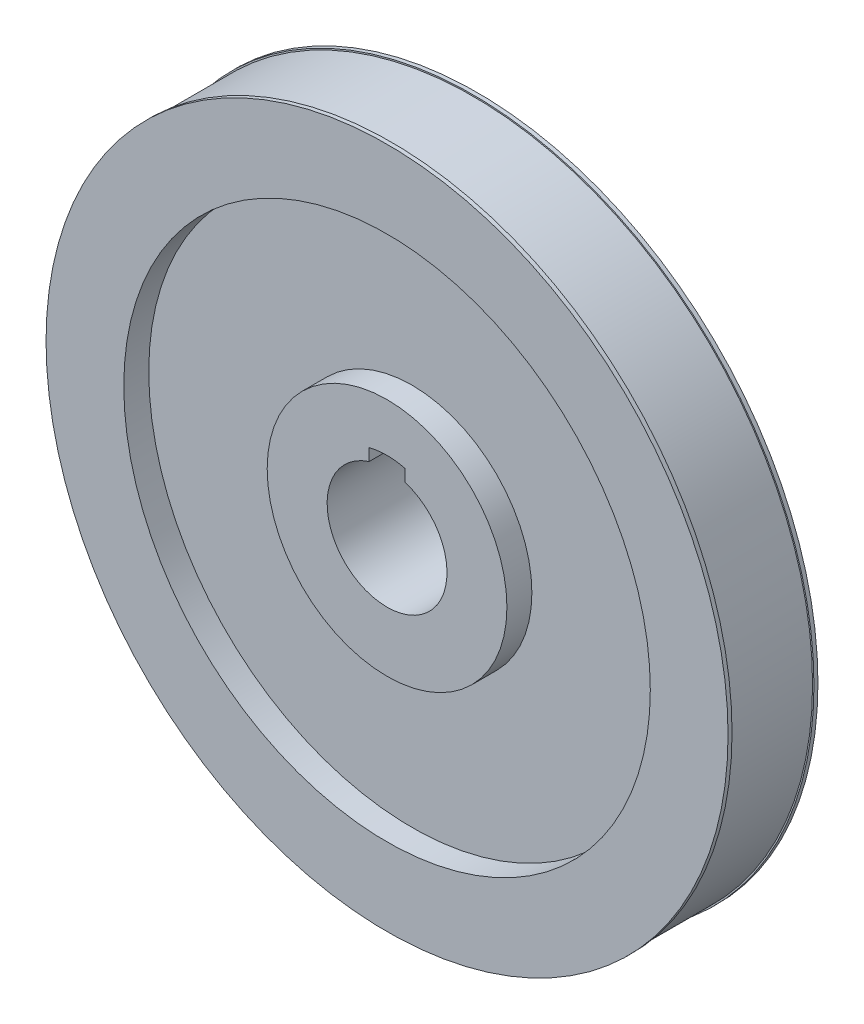
ISO-10303-21;
HEADER;
FILE_DESCRIPTION(('STEP AP214'),'2;1');
FILE_NAME('part.step','',(''),(''),'','','');
FILE_SCHEMA(('AUTOMOTIVE_DESIGN { 1 0 10303 214 1 1 1 1 }'));
ENDSEC;
DATA;
#1=APPLICATION_CONTEXT('core data for automotive mechanical design processes');
#2=APPLICATION_PROTOCOL_DEFINITION('international standard','automotive_design',2000,#1);
#3=PRODUCT_CONTEXT('',#1,'mechanical');
#4=PRODUCT('Part','Part','',(#3));
#5=PRODUCT_RELATED_PRODUCT_CATEGORY('part','',(#4));
#6=PRODUCT_DEFINITION_FORMATION('','',#4);
#7=PRODUCT_DEFINITION_CONTEXT('part definition',#1,'design');
#8=PRODUCT_DEFINITION('design','',#6,#7);
#9=PRODUCT_DEFINITION_SHAPE('','',#8);
#10=(LENGTH_UNIT() NAMED_UNIT(*) SI_UNIT(.MILLI.,.METRE.));
#11=(NAMED_UNIT(*) PLANE_ANGLE_UNIT() SI_UNIT($,.RADIAN.));
#12=(NAMED_UNIT(*) SI_UNIT($,.STERADIAN.) SOLID_ANGLE_UNIT());
#13=UNCERTAINTY_MEASURE_WITH_UNIT(LENGTH_MEASURE(1.E-05),#10,'distance_accuracy_value','');
#14=(GEOMETRIC_REPRESENTATION_CONTEXT(3) GLOBAL_UNCERTAINTY_ASSIGNED_CONTEXT((#13)) GLOBAL_UNIT_ASSIGNED_CONTEXT((#10,
#11,#12)) REPRESENTATION_CONTEXT('',''));
#15=CARTESIAN_POINT('',(0.,0.,0.));
#16=DIRECTION('',(0.,0.,1.));
#17=DIRECTION('',(1.,0.,0.));
#18=AXIS2_PLACEMENT_3D('',#15,#16,#17);
#19=CARTESIAN_POINT('',(0.,0.,22.5));
#20=DIRECTION('',(0.,0.,-1.));
#21=DIRECTION('',(-1.,0.,0.));
#22=AXIS2_PLACEMENT_3D('',#19,#20,#21);
#23=CYLINDRICAL_SURFACE('',#22,170.);
#24=CARTESIAN_POINT('',(0.,0.,20.5));
#25=DIRECTION('',(0.,0.,1.));
#26=DIRECTION('',(1.,0.,0.));
#27=AXIS2_PLACEMENT_3D('',#24,#25,#26);
#28=CIRCLE('',#27,170.);
#29=CARTESIAN_POINT('',(-170.,0.,20.5));
#30=VERTEX_POINT('',#29);
#31=EDGE_CURVE('E140',#30,#30,#28,.T.);
#32=CARTESIAN_POINT('',(0.,0.,-20.5));
#33=DIRECTION('',(0.,0.,-1.));
#34=DIRECTION('',(-1.,0.,0.));
#35=AXIS2_PLACEMENT_3D('',#32,#33,#34);
#36=CIRCLE('',#35,170.);
#37=CARTESIAN_POINT('',(-170.,0.,-20.5));
#38=VERTEX_POINT('',#37);
#39=EDGE_CURVE('E145',#38,#38,#36,.T.);
#40=CARTESIAN_POINT('',(-170.,0.,20.5));
#41=CARTESIAN_POINT('',(-170.,0.,20.0729166666667));
#42=CARTESIAN_POINT('',(-170.,0.,19.6458333333333));
#43=CARTESIAN_POINT('',(-170.,0.,18.7916666666667));
#44=CARTESIAN_POINT('',(-170.,0.,18.3645833333333));
#45=CARTESIAN_POINT('',(-170.,0.,17.5104166666667));
#46=CARTESIAN_POINT('',(-170.,0.,17.0833333333333));
#47=CARTESIAN_POINT('',(-170.,0.,16.2291666666667));
#48=CARTESIAN_POINT('',(-170.,0.,15.8020833333333));
#49=CARTESIAN_POINT('',(-170.,0.,14.9479166666667));
#50=CARTESIAN_POINT('',(-170.,0.,14.5208333333333));
#51=CARTESIAN_POINT('',(-170.,0.,13.6666666666667));
#52=CARTESIAN_POINT('',(-170.,0.,13.2395833333333));
#53=CARTESIAN_POINT('',(-170.,0.,12.3854166666667));
#54=CARTESIAN_POINT('',(-170.,0.,11.9583333333333));
#55=CARTESIAN_POINT('',(-170.,0.,11.1041666666667));
#56=CARTESIAN_POINT('',(-170.,0.,10.6770833333333));
#57=CARTESIAN_POINT('',(-170.,0.,9.82291666666666));
#58=CARTESIAN_POINT('',(-170.,0.,9.39583333333333));
#59=CARTESIAN_POINT('',(-170.,0.,8.54166666666667));
#60=CARTESIAN_POINT('',(-170.,0.,8.11458333333333));
#61=CARTESIAN_POINT('',(-170.,0.,7.26041666666667));
#62=CARTESIAN_POINT('',(-170.,0.,6.83333333333333));
#63=CARTESIAN_POINT('',(-170.,0.,5.97916666666667));
#64=CARTESIAN_POINT('',(-170.,0.,5.55208333333333));
#65=CARTESIAN_POINT('',(-170.,0.,4.69791666666667));
#66=CARTESIAN_POINT('',(-170.,0.,4.27083333333333));
#67=CARTESIAN_POINT('',(-170.,0.,3.41666666666667));
#68=CARTESIAN_POINT('',(-170.,0.,2.98958333333333));
#69=CARTESIAN_POINT('',(-170.,0.,2.13541666666667));
#70=CARTESIAN_POINT('',(-170.,0.,1.70833333333333));
#71=CARTESIAN_POINT('',(-170.,0.,0.854166666666667));
#72=CARTESIAN_POINT('',(-170.,0.,0.427083333333334));
#73=CARTESIAN_POINT('',(-170.,0.,-0.427083333333334));
#74=CARTESIAN_POINT('',(-170.,0.,-0.854166666666667));
#75=CARTESIAN_POINT('',(-170.,0.,-1.70833333333333));
#76=CARTESIAN_POINT('',(-170.,0.,-2.13541666666667));
#77=CARTESIAN_POINT('',(-170.,0.,-2.98958333333333));
#78=CARTESIAN_POINT('',(-170.,0.,-3.41666666666667));
#79=CARTESIAN_POINT('',(-170.,0.,-4.27083333333333));
#80=CARTESIAN_POINT('',(-170.,0.,-4.69791666666667));
#81=CARTESIAN_POINT('',(-170.,0.,-5.55208333333333));
#82=CARTESIAN_POINT('',(-170.,0.,-5.97916666666667));
#83=CARTESIAN_POINT('',(-170.,0.,-6.83333333333333));
#84=CARTESIAN_POINT('',(-170.,0.,-7.26041666666667));
#85=CARTESIAN_POINT('',(-170.,0.,-8.11458333333333));
#86=CARTESIAN_POINT('',(-170.,0.,-8.54166666666666));
#87=CARTESIAN_POINT('',(-170.,0.,-9.39583333333333));
#88=CARTESIAN_POINT('',(-170.,0.,-9.82291666666666));
#89=CARTESIAN_POINT('',(-170.,0.,-10.6770833333333));
#90=CARTESIAN_POINT('',(-170.,0.,-11.1041666666667));
#91=CARTESIAN_POINT('',(-170.,0.,-11.9583333333333));
#92=CARTESIAN_POINT('',(-170.,0.,-12.3854166666667));
#93=CARTESIAN_POINT('',(-170.,0.,-13.2395833333333));
#94=CARTESIAN_POINT('',(-170.,0.,-13.6666666666667));
#95=CARTESIAN_POINT('',(-170.,0.,-14.5208333333333));
#96=CARTESIAN_POINT('',(-170.,0.,-14.9479166666667));
#97=CARTESIAN_POINT('',(-170.,0.,-15.8020833333333));
#98=CARTESIAN_POINT('',(-170.,0.,-16.2291666666667));
#99=CARTESIAN_POINT('',(-170.,0.,-17.0833333333333));
#100=CARTESIAN_POINT('',(-170.,0.,-17.5104166666667));
#101=CARTESIAN_POINT('',(-170.,0.,-18.3645833333333));
#102=CARTESIAN_POINT('',(-170.,0.,-18.7916666666667));
#103=CARTESIAN_POINT('',(-170.,0.,-19.6458333333333));
#104=CARTESIAN_POINT('',(-170.,0.,-20.0729166666667));
#105=CARTESIAN_POINT('',(-170.,0.,-20.5));
#106=B_SPLINE_CURVE_WITH_KNOTS('',3,(#40,#41,#42,#43,#44,#45,#46,#47,#48,#49,#50,#51,#52,#53,
#54,#55,#56,#57,#58,#59,#60,#61,#62,#63,#64,#65,#66,#67,#68,#69,#70,#71,#72,#73,#74,#75,#76,#77,
#78,#79,#80,#81,#82,#83,#84,#85,#86,#87,#88,#89,#90,#91,#92,#93,#94,#95,#96,#97,#98,#99,#100,
#101,#102,#103,#104,#105),.UNSPECIFIED.,.F.,.F.,(4,2,2,2,2,2,2,2,2,2,2,2,2,2,2,2,2,2,2,2,2,2,2,
2,2,2,2,2,2,2,2,2,4),(0.,1.28125,2.5625,3.84375,5.125,6.40625,7.6875,8.96875,10.25,11.53125,
12.8125,14.09375,15.375,16.65625,17.9375,19.21875,20.5,21.78125,23.0625,24.34375,25.625,
26.90625,28.1875,29.46875,30.75,32.03125,33.3125,34.59375,35.875,37.15625,38.4375,39.71875,41.),.UNSPECIFIED.);
#107=EDGE_CURVE('BSEAM35',#30,#38,#106,.T.);
#108=ORIENTED_EDGE('',*,*,#31,.F.);
#109=ORIENTED_EDGE('',*,*,#39,.F.);
#110=ORIENTED_EDGE('',*,*,#107,.T.);
#111=ORIENTED_EDGE('',*,*,#107,.F.);
#112=EDGE_LOOP('',(#108,#110,#109,#111));
#113=FACE_BOUND('',#112,.T.);
#114=ADVANCED_FACE('F35',(#113),#23,.T.);
#115=CARTESIAN_POINT('',(0.,0.,20.5));
#116=DIRECTION('',(0.,0.,1.));
#117=DIRECTION('',(1.,0.,0.));
#118=AXIS2_PLACEMENT_3D('',#115,#116,#117);
#119=CYLINDRICAL_SURFACE('',#118,170.69);
#120=CARTESIAN_POINT('',(0.,0.,20.5));
#121=DIRECTION('',(0.,0.,1.));
#122=DIRECTION('',(1.,0.,0.));
#123=AXIS2_PLACEMENT_3D('',#120,#121,#122);
#124=CIRCLE('',#123,170.69);
#125=CARTESIAN_POINT('',(170.69,0.,20.5));
#126=VERTEX_POINT('',#125);
#127=EDGE_CURVE('E137',#126,#126,#124,.T.);
#128=ORIENTED_EDGE('',*,*,#127,.T.);
#129=EDGE_LOOP('',(#128));
#130=FACE_BOUND('',#129,.T.);
#131=CARTESIAN_POINT('',(0.,0.,22.5));
#132=DIRECTION('',(0.,0.,1.));
#133=DIRECTION('',(1.,0.,0.));
#134=AXIS2_PLACEMENT_3D('',#131,#132,#133);
#135=CIRCLE('',#134,170.69);
#136=CARTESIAN_POINT('',(170.69,0.,22.5));
#137=VERTEX_POINT('',#136);
#138=EDGE_CURVE('E134',#137,#137,#135,.T.);
#139=ORIENTED_EDGE('',*,*,#138,.F.);
#140=EDGE_LOOP('',(#139));
#141=FACE_BOUND('',#140,.T.);
#142=ADVANCED_FACE('F165',(#130,#141),#119,.T.);
#143=CARTESIAN_POINT('',(0.,0.,20.5));
#144=DIRECTION('',(0.,0.,1.));
#145=DIRECTION('',(1.,0.,0.));
#146=AXIS2_PLACEMENT_3D('',#143,#144,#145);
#147=PLANE('',#146);
#148=ORIENTED_EDGE('',*,*,#31,.T.);
#149=EDGE_LOOP('',(#148));
#150=FACE_BOUND('',#149,.T.);
#151=ORIENTED_EDGE('',*,*,#127,.F.);
#152=EDGE_LOOP('',(#151));
#153=FACE_BOUND('',#152,.T.);
#154=ADVANCED_FACE('F170',(#150,#153),#147,.F.);
#155=CARTESIAN_POINT('',(0.,0.,22.5));
#156=DIRECTION('',(0.,0.,1.));
#157=DIRECTION('',(1.,0.,0.));
#158=AXIS2_PLACEMENT_3D('',#155,#156,#157);
#159=PLANE('',#158);
#160=CARTESIAN_POINT('',(0.,0.,22.5));
#161=DIRECTION('',(0.,0.,1.));
#162=DIRECTION('',(1.,0.,0.));
#163=AXIS2_PLACEMENT_3D('',#160,#161,#162);
#164=CIRCLE('',#163,131.78);
#165=CARTESIAN_POINT('',(-131.78,0.,22.5));
#166=VERTEX_POINT('',#165);
#167=EDGE_CURVE('E125',#166,#166,#164,.T.);
#168=ORIENTED_EDGE('',*,*,#167,.F.);
#169=EDGE_LOOP('',(#168));
#170=FACE_BOUND('',#169,.T.);
#171=ORIENTED_EDGE('',*,*,#138,.T.);
#172=EDGE_LOOP('',(#171));
#173=FACE_BOUND('',#172,.T.);
#174=ADVANCED_FACE('F187',(#170,#173),#159,.T.);
#175=CARTESIAN_POINT('',(0.,0.,-20.5));
#176=DIRECTION('',(0.,0.,-1.));
#177=DIRECTION('',(-1.,0.,0.));
#178=AXIS2_PLACEMENT_3D('',#175,#176,#177);
#179=CYLINDRICAL_SURFACE('',#178,170.69);
#180=CARTESIAN_POINT('',(0.,0.,-20.5));
#181=DIRECTION('',(0.,0.,1.));
#182=DIRECTION('',(1.,0.,0.));
#183=AXIS2_PLACEMENT_3D('',#180,#181,#182);
#184=CIRCLE('',#183,170.69);
#185=CARTESIAN_POINT('',(170.69,0.,-20.5));
#186=VERTEX_POINT('',#185);
#187=EDGE_CURVE('E131',#186,#186,#184,.T.);
#188=ORIENTED_EDGE('',*,*,#187,.F.);
#189=EDGE_LOOP('',(#188));
#190=FACE_BOUND('',#189,.T.);
#191=CARTESIAN_POINT('',(0.,0.,-22.5));
#192=DIRECTION('',(0.,0.,1.));
#193=DIRECTION('',(1.,0.,0.));
#194=AXIS2_PLACEMENT_3D('',#191,#192,#193);
#195=CIRCLE('',#194,170.69);
#196=CARTESIAN_POINT('',(170.69,0.,-22.5));
#197=VERTEX_POINT('',#196);
#198=EDGE_CURVE('E128',#197,#197,#195,.T.);
#199=ORIENTED_EDGE('',*,*,#198,.T.);
#200=EDGE_LOOP('',(#199));
#201=FACE_BOUND('',#200,.T.);
#202=ADVANCED_FACE('F181',(#190,#201),#179,.T.);
#203=CARTESIAN_POINT('',(0.,0.,-20.5));
#204=DIRECTION('',(0.,0.,-1.));
#205=DIRECTION('',(1.,0.,0.));
#206=AXIS2_PLACEMENT_3D('',#203,#204,#205);
#207=PLANE('',#206);
#208=ORIENTED_EDGE('',*,*,#39,.T.);
#209=EDGE_LOOP('',(#208));
#210=FACE_BOUND('',#209,.T.);
#211=ORIENTED_EDGE('',*,*,#187,.T.);
#212=EDGE_LOOP('',(#211));
#213=FACE_BOUND('',#212,.T.);
#214=ADVANCED_FACE('F177',(#210,#213),#207,.F.);
#215=CARTESIAN_POINT('',(0.,0.,-22.5));
#216=DIRECTION('',(0.,0.,1.));
#217=DIRECTION('',(1.,0.,0.));
#218=AXIS2_PLACEMENT_3D('',#215,#216,#217);
#219=PLANE('',#218);
#220=CARTESIAN_POINT('',(0.,0.,-22.5));
#221=DIRECTION('',(0.,0.,1.));
#222=DIRECTION('',(1.,0.,0.));
#223=AXIS2_PLACEMENT_3D('',#220,#221,#222);
#224=CIRCLE('',#223,131.78);
#225=CARTESIAN_POINT('',(131.78,0.,-22.5));
#226=VERTEX_POINT('',#225);
#227=EDGE_CURVE('E113',#226,#226,#224,.T.);
#228=ORIENTED_EDGE('',*,*,#227,.T.);
#229=EDGE_LOOP('',(#228));
#230=FACE_BOUND('',#229,.T.);
#231=ORIENTED_EDGE('',*,*,#198,.F.);
#232=EDGE_LOOP('',(#231));
#233=FACE_BOUND('',#232,.T.);
#234=ADVANCED_FACE('F180',(#230,#233),#219,.F.);
#235=CARTESIAN_POINT('',(0.,0.,10.));
#236=DIRECTION('',(0.,0.,1.));
#237=DIRECTION('',(1.,0.,0.));
#238=AXIS2_PLACEMENT_3D('',#235,#236,#237);
#239=PLANE('',#238);
#240=CARTESIAN_POINT('',(0.,0.,10.));
#241=DIRECTION('',(0.,0.,1.));
#242=DIRECTION('',(1.,0.,0.));
#243=AXIS2_PLACEMENT_3D('',#240,#241,#242);
#244=CIRCLE('',#243,131.78);
#245=CARTESIAN_POINT('',(-131.78,0.,10.));
#246=VERTEX_POINT('',#245);
#247=EDGE_CURVE('E122',#246,#246,#244,.T.);
#248=ORIENTED_EDGE('',*,*,#247,.T.);
#249=EDGE_LOOP('',(#248));
#250=FACE_BOUND('',#249,.T.);
#251=CARTESIAN_POINT('',(0.,0.,10.));
#252=DIRECTION('',(0.,0.,1.));
#253=DIRECTION('',(1.,0.,0.));
#254=AXIS2_PLACEMENT_3D('',#251,#252,#253);
#255=CIRCLE('',#254,60.);
#256=CARTESIAN_POINT('',(-60.,0.,10.));
#257=VERTEX_POINT('',#256);
#258=EDGE_CURVE('E116',#257,#257,#255,.T.);
#259=ORIENTED_EDGE('',*,*,#258,.F.);
#260=EDGE_LOOP('',(#259));
#261=FACE_BOUND('',#260,.T.);
#262=ADVANCED_FACE('F192',(#250,#261),#239,.T.);
#263=CARTESIAN_POINT('',(0.,0.,22.5));
#264=DIRECTION('',(0.,0.,-1.));
#265=DIRECTION('',(-1.,0.,0.));
#266=AXIS2_PLACEMENT_3D('',#263,#264,#265);
#267=CYLINDRICAL_SURFACE('',#266,131.78);
#268=CARTESIAN_POINT('',(-131.78,0.,22.5));
#269=CARTESIAN_POINT('',(-131.78,0.,22.3697916666667));
#270=CARTESIAN_POINT('',(-131.78,0.,22.2395833333333));
#271=CARTESIAN_POINT('',(-131.78,0.,21.9791666666667));
#272=CARTESIAN_POINT('',(-131.78,0.,21.8489583333333));
#273=CARTESIAN_POINT('',(-131.78,0.,21.5885416666667));
#274=CARTESIAN_POINT('',(-131.78,0.,21.4583333333333));
#275=CARTESIAN_POINT('',(-131.78,0.,21.1979166666667));
#276=CARTESIAN_POINT('',(-131.78,0.,21.0677083333333));
#277=CARTESIAN_POINT('',(-131.78,0.,20.8072916666667));
#278=CARTESIAN_POINT('',(-131.78,0.,20.6770833333333));
#279=CARTESIAN_POINT('',(-131.78,0.,20.4166666666667));
#280=CARTESIAN_POINT('',(-131.78,0.,20.2864583333333));
#281=CARTESIAN_POINT('',(-131.78,0.,20.0260416666667));
#282=CARTESIAN_POINT('',(-131.78,0.,19.8958333333333));
#283=CARTESIAN_POINT('',(-131.78,0.,19.6354166666667));
#284=CARTESIAN_POINT('',(-131.78,0.,19.5052083333333));
#285=CARTESIAN_POINT('',(-131.78,0.,19.2447916666667));
#286=CARTESIAN_POINT('',(-131.78,0.,19.1145833333333));
#287=CARTESIAN_POINT('',(-131.78,0.,18.8541666666667));
#288=CARTESIAN_POINT('',(-131.78,0.,18.7239583333333));
#289=CARTESIAN_POINT('',(-131.78,0.,18.4635416666667));
#290=CARTESIAN_POINT('',(-131.78,0.,18.3333333333333));
#291=CARTESIAN_POINT('',(-131.78,0.,18.0729166666667));
#292=CARTESIAN_POINT('',(-131.78,0.,17.9427083333333));
#293=CARTESIAN_POINT('',(-131.78,0.,17.6822916666667));
#294=CARTESIAN_POINT('',(-131.78,0.,17.5520833333333));
#295=CARTESIAN_POINT('',(-131.78,0.,17.2916666666667));
#296=CARTESIAN_POINT('',(-131.78,0.,17.1614583333333));
#297=CARTESIAN_POINT('',(-131.78,0.,16.9010416666667));
#298=CARTESIAN_POINT('',(-131.78,0.,16.7708333333333));
#299=CARTESIAN_POINT('',(-131.78,0.,16.5104166666667));
#300=CARTESIAN_POINT('',(-131.78,0.,16.3802083333333));
#301=CARTESIAN_POINT('',(-131.78,0.,16.1197916666667));
#302=CARTESIAN_POINT('',(-131.78,0.,15.9895833333333));
#303=CARTESIAN_POINT('',(-131.78,0.,15.7291666666667));
#304=CARTESIAN_POINT('',(-131.78,0.,15.5989583333333));
#305=CARTESIAN_POINT('',(-131.78,0.,15.3385416666667));
#306=CARTESIAN_POINT('',(-131.78,0.,15.2083333333333));
#307=CARTESIAN_POINT('',(-131.78,0.,14.9479166666667));
#308=CARTESIAN_POINT('',(-131.78,0.,14.8177083333333));
#309=CARTESIAN_POINT('',(-131.78,0.,14.5572916666667));
#310=CARTESIAN_POINT('',(-131.78,0.,14.4270833333333));
#311=CARTESIAN_POINT('',(-131.78,0.,14.1666666666667));
#312=CARTESIAN_POINT('',(-131.78,0.,14.0364583333333));
#313=CARTESIAN_POINT('',(-131.78,0.,13.7760416666667));
#314=CARTESIAN_POINT('',(-131.78,0.,13.6458333333333));
#315=CARTESIAN_POINT('',(-131.78,0.,13.3854166666667));
#316=CARTESIAN_POINT('',(-131.78,0.,13.2552083333333));
#317=CARTESIAN_POINT('',(-131.78,0.,12.9947916666667));
#318=CARTESIAN_POINT('',(-131.78,0.,12.8645833333333));
#319=CARTESIAN_POINT('',(-131.78,0.,12.6041666666667));
#320=CARTESIAN_POINT('',(-131.78,0.,12.4739583333333));
#321=CARTESIAN_POINT('',(-131.78,0.,12.2135416666667));
#322=CARTESIAN_POINT('',(-131.78,0.,12.0833333333333));
#323=CARTESIAN_POINT('',(-131.78,0.,11.8229166666667));
#324=CARTESIAN_POINT('',(-131.78,0.,11.6927083333333));
#325=CARTESIAN_POINT('',(-131.78,0.,11.4322916666667));
#326=CARTESIAN_POINT('',(-131.78,0.,11.3020833333333));
#327=CARTESIAN_POINT('',(-131.78,0.,11.0416666666667));
#328=CARTESIAN_POINT('',(-131.78,0.,10.9114583333333));
#329=CARTESIAN_POINT('',(-131.78,0.,10.6510416666667));
#330=CARTESIAN_POINT('',(-131.78,0.,10.5208333333333));
#331=CARTESIAN_POINT('',(-131.78,0.,10.2604166666667));
#332=CARTESIAN_POINT('',(-131.78,0.,10.1302083333333));
#333=CARTESIAN_POINT('',(-131.78,0.,10.));
#334=B_SPLINE_CURVE_WITH_KNOTS('',3,(#268,#269,#270,#271,#272,#273,#274,#275,#276,#277,#278,
#279,#280,#281,#282,#283,#284,#285,#286,#287,#288,#289,#290,#291,#292,#293,#294,#295,#296,#297,
#298,#299,#300,#301,#302,#303,#304,#305,#306,#307,#308,#309,#310,#311,#312,#313,#314,#315,#316,
#317,#318,#319,#320,#321,#322,#323,#324,#325,#326,#327,#328,#329,#330,#331,#332,#333),
.UNSPECIFIED.,.F.,.F.,(4,2,2,2,2,2,2,2,2,2,2,2,2,2,2,2,2,2,2,2,2,2,2,2,2,2,2,2,2,2,2,2,4),(0.,
0.390625000000002,0.781250000000001,1.171875,1.5625,1.953125,2.34375,2.734375,3.125,3.515625,
3.90625,4.296875,4.6875,5.078125,5.46875,5.859375,6.25,6.640625,7.03125,7.421875,7.8125,
8.203125,8.59375,8.984375,9.375,9.765625,10.15625,10.546875,10.9375,11.328125,11.71875,
12.109375,12.5),.UNSPECIFIED.);
#335=EDGE_CURVE('BSEAM197',#166,#246,#334,.T.);
#336=ORIENTED_EDGE('',*,*,#167,.T.);
#337=ORIENTED_EDGE('',*,*,#247,.F.);
#338=ORIENTED_EDGE('',*,*,#335,.T.);
#339=ORIENTED_EDGE('',*,*,#335,.F.);
#340=EDGE_LOOP('',(#336,#338,#337,#339));
#341=FACE_BOUND('',#340,.T.);
#342=ADVANCED_FACE('F197',(#341),#267,.F.);
#343=CARTESIAN_POINT('',(0.,0.,22.5));
#344=DIRECTION('',(0.,0.,-1.));
#345=DIRECTION('',(-1.,0.,0.));
#346=AXIS2_PLACEMENT_3D('',#343,#344,#345);
#347=CYLINDRICAL_SURFACE('',#346,60.);
#348=CARTESIAN_POINT('',(0.,0.,22.5));
#349=DIRECTION('',(0.,0.,1.));
#350=DIRECTION('',(1.,0.,0.));
#351=AXIS2_PLACEMENT_3D('',#348,#349,#350);
#352=CIRCLE('',#351,60.);
#353=CARTESIAN_POINT('',(-60.,0.,22.5));
#354=VERTEX_POINT('',#353);
#355=EDGE_CURVE('E119',#354,#354,#352,.T.);
#356=CARTESIAN_POINT('',(-60.,0.,22.5));
#357=CARTESIAN_POINT('',(-60.,0.,22.3697916666667));
#358=CARTESIAN_POINT('',(-60.,0.,22.2395833333333));
#359=CARTESIAN_POINT('',(-60.,0.,21.9791666666667));
#360=CARTESIAN_POINT('',(-60.,0.,21.8489583333333));
#361=CARTESIAN_POINT('',(-60.,0.,21.5885416666667));
#362=CARTESIAN_POINT('',(-60.,0.,21.4583333333333));
#363=CARTESIAN_POINT('',(-60.,0.,21.1979166666667));
#364=CARTESIAN_POINT('',(-60.,0.,21.0677083333333));
#365=CARTESIAN_POINT('',(-60.,0.,20.8072916666667));
#366=CARTESIAN_POINT('',(-60.,0.,20.6770833333333));
#367=CARTESIAN_POINT('',(-60.,0.,20.4166666666667));
#368=CARTESIAN_POINT('',(-60.,0.,20.2864583333333));
#369=CARTESIAN_POINT('',(-60.,0.,20.0260416666667));
#370=CARTESIAN_POINT('',(-60.,0.,19.8958333333333));
#371=CARTESIAN_POINT('',(-60.,0.,19.6354166666667));
#372=CARTESIAN_POINT('',(-60.,0.,19.5052083333333));
#373=CARTESIAN_POINT('',(-60.,0.,19.2447916666667));
#374=CARTESIAN_POINT('',(-60.,0.,19.1145833333333));
#375=CARTESIAN_POINT('',(-60.,0.,18.8541666666667));
#376=CARTESIAN_POINT('',(-60.,0.,18.7239583333333));
#377=CARTESIAN_POINT('',(-60.,0.,18.4635416666667));
#378=CARTESIAN_POINT('',(-60.,0.,18.3333333333333));
#379=CARTESIAN_POINT('',(-60.,0.,18.0729166666667));
#380=CARTESIAN_POINT('',(-60.,0.,17.9427083333333));
#381=CARTESIAN_POINT('',(-60.,0.,17.6822916666667));
#382=CARTESIAN_POINT('',(-60.,0.,17.5520833333333));
#383=CARTESIAN_POINT('',(-60.,0.,17.2916666666667));
#384=CARTESIAN_POINT('',(-60.,0.,17.1614583333333));
#385=CARTESIAN_POINT('',(-60.,0.,16.9010416666667));
#386=CARTESIAN_POINT('',(-60.,0.,16.7708333333333));
#387=CARTESIAN_POINT('',(-60.,0.,16.5104166666667));
#388=CARTESIAN_POINT('',(-60.,0.,16.3802083333333));
#389=CARTESIAN_POINT('',(-60.,0.,16.1197916666667));
#390=CARTESIAN_POINT('',(-60.,0.,15.9895833333333));
#391=CARTESIAN_POINT('',(-60.,0.,15.7291666666667));
#392=CARTESIAN_POINT('',(-60.,0.,15.5989583333333));
#393=CARTESIAN_POINT('',(-60.,0.,15.3385416666667));
#394=CARTESIAN_POINT('',(-60.,0.,15.2083333333333));
#395=CARTESIAN_POINT('',(-60.,0.,14.9479166666667));
#396=CARTESIAN_POINT('',(-60.,0.,14.8177083333333));
#397=CARTESIAN_POINT('',(-60.,0.,14.5572916666667));
#398=CARTESIAN_POINT('',(-60.,0.,14.4270833333333));
#399=CARTESIAN_POINT('',(-60.,0.,14.1666666666667));
#400=CARTESIAN_POINT('',(-60.,0.,14.0364583333333));
#401=CARTESIAN_POINT('',(-60.,0.,13.7760416666667));
#402=CARTESIAN_POINT('',(-60.,0.,13.6458333333333));
#403=CARTESIAN_POINT('',(-60.,0.,13.3854166666667));
#404=CARTESIAN_POINT('',(-60.,0.,13.2552083333333));
#405=CARTESIAN_POINT('',(-60.,0.,12.9947916666667));
#406=CARTESIAN_POINT('',(-60.,0.,12.8645833333333));
#407=CARTESIAN_POINT('',(-60.,0.,12.6041666666667));
#408=CARTESIAN_POINT('',(-60.,0.,12.4739583333333));
#409=CARTESIAN_POINT('',(-60.,0.,12.2135416666667));
#410=CARTESIAN_POINT('',(-60.,0.,12.0833333333333));
#411=CARTESIAN_POINT('',(-60.,0.,11.8229166666667));
#412=CARTESIAN_POINT('',(-60.,0.,11.6927083333333));
#413=CARTESIAN_POINT('',(-60.,0.,11.4322916666667));
#414=CARTESIAN_POINT('',(-60.,0.,11.3020833333333));
#415=CARTESIAN_POINT('',(-60.,0.,11.0416666666667));
#416=CARTESIAN_POINT('',(-60.,0.,10.9114583333333));
#417=CARTESIAN_POINT('',(-60.,0.,10.6510416666667));
#418=CARTESIAN_POINT('',(-60.,0.,10.5208333333333));
#419=CARTESIAN_POINT('',(-60.,0.,10.2604166666667));
#420=CARTESIAN_POINT('',(-60.,0.,10.1302083333333));
#421=CARTESIAN_POINT('',(-60.,0.,10.));
#422=B_SPLINE_CURVE_WITH_KNOTS('',3,(#356,#357,#358,#359,#360,#361,#362,#363,#364,#365,#366,
#367,#368,#369,#370,#371,#372,#373,#374,#375,#376,#377,#378,#379,#380,#381,#382,#383,#384,#385,
#386,#387,#388,#389,#390,#391,#392,#393,#394,#395,#396,#397,#398,#399,#400,#401,#402,#403,#404,
#405,#406,#407,#408,#409,#410,#411,#412,#413,#414,#415,#416,#417,#418,#419,#420,#421),
.UNSPECIFIED.,.F.,.F.,(4,2,2,2,2,2,2,2,2,2,2,2,2,2,2,2,2,2,2,2,2,2,2,2,2,2,2,2,2,2,2,2,4),(0.,
0.390625000000002,0.781250000000001,1.171875,1.5625,1.953125,2.34375,2.734375,3.125,3.515625,
3.90625,4.296875,4.6875,5.078125,5.46875,5.859375,6.25,6.640625,7.03125,7.421875,7.8125,
8.203125,8.59375,8.984375,9.375,9.765625,10.15625,10.546875,10.9375,11.328125,11.71875,
12.109375,12.5),.UNSPECIFIED.);
#423=EDGE_CURVE('BSEAM220',#354,#257,#422,.T.);
#424=ORIENTED_EDGE('',*,*,#355,.F.);
#425=ORIENTED_EDGE('',*,*,#258,.T.);
#426=ORIENTED_EDGE('',*,*,#423,.T.);
#427=ORIENTED_EDGE('',*,*,#423,.F.);
#428=EDGE_LOOP('',(#424,#426,#425,#427));
#429=FACE_BOUND('',#428,.T.);
#430=ADVANCED_FACE('F220',(#429),#347,.T.);
#431=DIRECTION('',(0.,-1.,0.));
#432=VECTOR('',#431,1.);
#433=CARTESIAN_POINT('',(-9.,20.2728873002203,22.5));
#434=LINE('',#433,#432);
#435=CARTESIAN_POINT('',(-9.,34.6502525243323,22.5));
#436=VERTEX_POINT('',#435);
#437=CARTESIAN_POINT('',(-9.,28.6181760425084,22.5));
#438=VERTEX_POINT('',#437);
#439=EDGE_CURVE('E93',#436,#438,#434,.T.);
#440=ORIENTED_EDGE('',*,*,#439,.F.);
#441=CARTESIAN_POINT('',(0.,0.,22.5));
#442=DIRECTION('',(0.,0.,1.));
#443=DIRECTION('',(1.,0.,0.));
#444=AXIS2_PLACEMENT_3D('',#441,#442,#443);
#445=CIRCLE('',#444,35.8);
#446=CARTESIAN_POINT('',(8.99999999999999,34.6502525243323,22.5));
#447=VERTEX_POINT('',#446);
#448=EDGE_CURVE('E95',#447,#436,#445,.T.);
#449=ORIENTED_EDGE('',*,*,#448,.F.);
#450=DIRECTION('',(0.,1.,0.));
#451=VECTOR('',#450,1.);
#452=CARTESIAN_POINT('',(9.,20.2728873002203,22.5));
#453=LINE('',#452,#451);
#454=CARTESIAN_POINT('',(9.,28.6181760425084,22.5));
#455=VERTEX_POINT('',#454);
#456=EDGE_CURVE('E76',#455,#447,#453,.T.);
#457=ORIENTED_EDGE('',*,*,#456,.F.);
#458=CARTESIAN_POINT('',(0.,0.,22.5));
#459=DIRECTION('',(0.,0.,1.));
#460=DIRECTION('',(1.,0.,0.));
#461=AXIS2_PLACEMENT_3D('',#458,#459,#460);
#462=CIRCLE('',#461,30.);
#463=EDGE_CURVE('E101',#438,#455,#462,.T.);
#464=ORIENTED_EDGE('',*,*,#463,.F.);
#465=EDGE_LOOP('',(#440,#449,#457,#464));
#466=FACE_BOUND('',#465,.T.);
#467=ORIENTED_EDGE('',*,*,#355,.T.);
#468=EDGE_LOOP('',(#467));
#469=FACE_BOUND('',#468,.T.);
#470=ADVANCED_FACE('F152',(#466,#469),#159,.T.);
#471=CARTESIAN_POINT('',(0.,0.,-22.5));
#472=DIRECTION('',(0.,0.,1.));
#473=DIRECTION('',(1.,0.,0.));
#474=AXIS2_PLACEMENT_3D('',#471,#472,#473);
#475=CYLINDRICAL_SURFACE('',#474,131.78);
#476=CARTESIAN_POINT('',(0.,0.,-10.));
#477=DIRECTION('',(0.,0.,1.));
#478=DIRECTION('',(1.,0.,0.));
#479=AXIS2_PLACEMENT_3D('',#476,#477,#478);
#480=CIRCLE('',#479,131.78);
#481=CARTESIAN_POINT('',(131.78,0.,-10.));
#482=VERTEX_POINT('',#481);
#483=EDGE_CURVE('E110',#482,#482,#480,.T.);
#484=CARTESIAN_POINT('',(131.78,0.,-22.5));
#485=CARTESIAN_POINT('',(131.78,0.,-22.3697916666667));
#486=CARTESIAN_POINT('',(131.78,0.,-22.2395833333333));
#487=CARTESIAN_POINT('',(131.78,0.,-21.9791666666667));
#488=CARTESIAN_POINT('',(131.78,0.,-21.8489583333333));
#489=CARTESIAN_POINT('',(131.78,0.,-21.5885416666667));
#490=CARTESIAN_POINT('',(131.78,0.,-21.4583333333333));
#491=CARTESIAN_POINT('',(131.78,0.,-21.1979166666667));
#492=CARTESIAN_POINT('',(131.78,0.,-21.0677083333333));
#493=CARTESIAN_POINT('',(131.78,0.,-20.8072916666667));
#494=CARTESIAN_POINT('',(131.78,0.,-20.6770833333333));
#495=CARTESIAN_POINT('',(131.78,0.,-20.4166666666667));
#496=CARTESIAN_POINT('',(131.78,0.,-20.2864583333333));
#497=CARTESIAN_POINT('',(131.78,0.,-20.0260416666667));
#498=CARTESIAN_POINT('',(131.78,0.,-19.8958333333333));
#499=CARTESIAN_POINT('',(131.78,0.,-19.6354166666667));
#500=CARTESIAN_POINT('',(131.78,0.,-19.5052083333333));
#501=CARTESIAN_POINT('',(131.78,0.,-19.2447916666667));
#502=CARTESIAN_POINT('',(131.78,0.,-19.1145833333333));
#503=CARTESIAN_POINT('',(131.78,0.,-18.8541666666667));
#504=CARTESIAN_POINT('',(131.78,0.,-18.7239583333333));
#505=CARTESIAN_POINT('',(131.78,0.,-18.4635416666667));
#506=CARTESIAN_POINT('',(131.78,0.,-18.3333333333333));
#507=CARTESIAN_POINT('',(131.78,0.,-18.0729166666667));
#508=CARTESIAN_POINT('',(131.78,0.,-17.9427083333333));
#509=CARTESIAN_POINT('',(131.78,0.,-17.6822916666667));
#510=CARTESIAN_POINT('',(131.78,0.,-17.5520833333333));
#511=CARTESIAN_POINT('',(131.78,0.,-17.2916666666667));
#512=CARTESIAN_POINT('',(131.78,0.,-17.1614583333333));
#513=CARTESIAN_POINT('',(131.78,0.,-16.9010416666667));
#514=CARTESIAN_POINT('',(131.78,0.,-16.7708333333333));
#515=CARTESIAN_POINT('',(131.78,0.,-16.5104166666667));
#516=CARTESIAN_POINT('',(131.78,0.,-16.3802083333333));
#517=CARTESIAN_POINT('',(131.78,0.,-16.1197916666667));
#518=CARTESIAN_POINT('',(131.78,0.,-15.9895833333333));
#519=CARTESIAN_POINT('',(131.78,0.,-15.7291666666667));
#520=CARTESIAN_POINT('',(131.78,0.,-15.5989583333333));
#521=CARTESIAN_POINT('',(131.78,0.,-15.3385416666667));
#522=CARTESIAN_POINT('',(131.78,0.,-15.2083333333333));
#523=CARTESIAN_POINT('',(131.78,0.,-14.9479166666667));
#524=CARTESIAN_POINT('',(131.78,0.,-14.8177083333333));
#525=CARTESIAN_POINT('',(131.78,0.,-14.5572916666667));
#526=CARTESIAN_POINT('',(131.78,0.,-14.4270833333333));
#527=CARTESIAN_POINT('',(131.78,0.,-14.1666666666667));
#528=CARTESIAN_POINT('',(131.78,0.,-14.0364583333333));
#529=CARTESIAN_POINT('',(131.78,0.,-13.7760416666667));
#530=CARTESIAN_POINT('',(131.78,0.,-13.6458333333333));
#531=CARTESIAN_POINT('',(131.78,0.,-13.3854166666667));
#532=CARTESIAN_POINT('',(131.78,0.,-13.2552083333333));
#533=CARTESIAN_POINT('',(131.78,0.,-12.9947916666667));
#534=CARTESIAN_POINT('',(131.78,0.,-12.8645833333333));
#535=CARTESIAN_POINT('',(131.78,0.,-12.6041666666667));
#536=CARTESIAN_POINT('',(131.78,0.,-12.4739583333333));
#537=CARTESIAN_POINT('',(131.78,0.,-12.2135416666667));
#538=CARTESIAN_POINT('',(131.78,0.,-12.0833333333333));
#539=CARTESIAN_POINT('',(131.78,0.,-11.8229166666667));
#540=CARTESIAN_POINT('',(131.78,0.,-11.6927083333333));
#541=CARTESIAN_POINT('',(131.78,0.,-11.4322916666667));
#542=CARTESIAN_POINT('',(131.78,0.,-11.3020833333333));
#543=CARTESIAN_POINT('',(131.78,0.,-11.0416666666667));
#544=CARTESIAN_POINT('',(131.78,0.,-10.9114583333333));
#545=CARTESIAN_POINT('',(131.78,0.,-10.6510416666667));
#546=CARTESIAN_POINT('',(131.78,0.,-10.5208333333333));
#547=CARTESIAN_POINT('',(131.78,0.,-10.2604166666667));
#548=CARTESIAN_POINT('',(131.78,0.,-10.1302083333333));
#549=CARTESIAN_POINT('',(131.78,0.,-10.));
#550=B_SPLINE_CURVE_WITH_KNOTS('',3,(#484,#485,#486,#487,#488,#489,#490,#491,#492,#493,#494,
#495,#496,#497,#498,#499,#500,#501,#502,#503,#504,#505,#506,#507,#508,#509,#510,#511,#512,#513,
#514,#515,#516,#517,#518,#519,#520,#521,#522,#523,#524,#525,#526,#527,#528,#529,#530,#531,#532,
#533,#534,#535,#536,#537,#538,#539,#540,#541,#542,#543,#544,#545,#546,#547,#548,#549),
.UNSPECIFIED.,.F.,.F.,(4,2,2,2,2,2,2,2,2,2,2,2,2,2,2,2,2,2,2,2,2,2,2,2,2,2,2,2,2,2,2,2,4),(0.,
0.390624999999999,0.781249999999997,1.171875,1.5625,1.953125,2.34375,2.734375,3.125,3.515625,
3.90625,4.296875,4.6875,5.078125,5.46875,5.859375,6.25,6.640625,7.03125,7.421875,7.8125,
8.203125,8.59375,8.984375,9.375,9.765625,10.15625,10.546875,10.9375,11.328125,11.71875,
12.109375,12.5),.UNSPECIFIED.);
#551=EDGE_CURVE('BSEAM212',#226,#482,#550,.T.);
#552=ORIENTED_EDGE('',*,*,#227,.F.);
#553=ORIENTED_EDGE('',*,*,#483,.T.);
#554=ORIENTED_EDGE('',*,*,#551,.T.);
#555=ORIENTED_EDGE('',*,*,#551,.F.);
#556=EDGE_LOOP('',(#552,#554,#553,#555));
#557=FACE_BOUND('',#556,.T.);
#558=ADVANCED_FACE('F212',(#557),#475,.F.);
#559=CARTESIAN_POINT('',(0.,0.,-10.));
#560=DIRECTION('',(0.,0.,-1.));
#561=DIRECTION('',(1.,0.,0.));
#562=AXIS2_PLACEMENT_3D('',#559,#560,#561);
#563=PLANE('',#562);
#564=CARTESIAN_POINT('',(0.,0.,-10.));
#565=DIRECTION('',(0.,0.,1.));
#566=DIRECTION('',(1.,0.,0.));
#567=AXIS2_PLACEMENT_3D('',#564,#565,#566);
#568=CIRCLE('',#567,60.);
#569=CARTESIAN_POINT('',(60.,0.,-10.));
#570=VERTEX_POINT('',#569);
#571=EDGE_CURVE('E104',#570,#570,#568,.T.);
#572=ORIENTED_EDGE('',*,*,#571,.T.);
#573=EDGE_LOOP('',(#572));
#574=FACE_BOUND('',#573,.T.);
#575=ORIENTED_EDGE('',*,*,#483,.F.);
#576=EDGE_LOOP('',(#575));
#577=FACE_BOUND('',#576,.T.);
#578=ADVANCED_FACE('F206',(#574,#577),#563,.T.);
#579=CARTESIAN_POINT('',(0.,0.,-22.5));
#580=DIRECTION('',(0.,0.,1.));
#581=DIRECTION('',(1.,0.,0.));
#582=AXIS2_PLACEMENT_3D('',#579,#580,#581);
#583=CYLINDRICAL_SURFACE('',#582,60.);
#584=CARTESIAN_POINT('',(0.,0.,-22.5));
#585=DIRECTION('',(0.,0.,1.));
#586=DIRECTION('',(1.,0.,0.));
#587=AXIS2_PLACEMENT_3D('',#584,#585,#586);
#588=CIRCLE('',#587,60.);
#589=CARTESIAN_POINT('',(60.,0.,-22.5));
#590=VERTEX_POINT('',#589);
#591=EDGE_CURVE('E107',#590,#590,#588,.T.);
#592=CARTESIAN_POINT('',(60.,0.,-22.5));
#593=CARTESIAN_POINT('',(60.,0.,-22.3697916666667));
#594=CARTESIAN_POINT('',(60.,0.,-22.2395833333333));
#595=CARTESIAN_POINT('',(60.,0.,-21.9791666666667));
#596=CARTESIAN_POINT('',(60.,0.,-21.8489583333333));
#597=CARTESIAN_POINT('',(60.,0.,-21.5885416666667));
#598=CARTESIAN_POINT('',(60.,0.,-21.4583333333333));
#599=CARTESIAN_POINT('',(60.,0.,-21.1979166666667));
#600=CARTESIAN_POINT('',(60.,0.,-21.0677083333333));
#601=CARTESIAN_POINT('',(60.,0.,-20.8072916666667));
#602=CARTESIAN_POINT('',(60.,0.,-20.6770833333333));
#603=CARTESIAN_POINT('',(60.,0.,-20.4166666666667));
#604=CARTESIAN_POINT('',(60.,0.,-20.2864583333333));
#605=CARTESIAN_POINT('',(60.,0.,-20.0260416666667));
#606=CARTESIAN_POINT('',(60.,0.,-19.8958333333333));
#607=CARTESIAN_POINT('',(60.,0.,-19.6354166666667));
#608=CARTESIAN_POINT('',(60.,0.,-19.5052083333333));
#609=CARTESIAN_POINT('',(60.,0.,-19.2447916666667));
#610=CARTESIAN_POINT('',(60.,0.,-19.1145833333333));
#611=CARTESIAN_POINT('',(60.,0.,-18.8541666666667));
#612=CARTESIAN_POINT('',(60.,0.,-18.7239583333333));
#613=CARTESIAN_POINT('',(60.,0.,-18.4635416666667));
#614=CARTESIAN_POINT('',(60.,0.,-18.3333333333333));
#615=CARTESIAN_POINT('',(60.,0.,-18.0729166666667));
#616=CARTESIAN_POINT('',(60.,0.,-17.9427083333333));
#617=CARTESIAN_POINT('',(60.,0.,-17.6822916666667));
#618=CARTESIAN_POINT('',(60.,0.,-17.5520833333333));
#619=CARTESIAN_POINT('',(60.,0.,-17.2916666666667));
#620=CARTESIAN_POINT('',(60.,0.,-17.1614583333333));
#621=CARTESIAN_POINT('',(60.,0.,-16.9010416666667));
#622=CARTESIAN_POINT('',(60.,0.,-16.7708333333333));
#623=CARTESIAN_POINT('',(60.,0.,-16.5104166666667));
#624=CARTESIAN_POINT('',(60.,0.,-16.3802083333333));
#625=CARTESIAN_POINT('',(60.,0.,-16.1197916666667));
#626=CARTESIAN_POINT('',(60.,0.,-15.9895833333333));
#627=CARTESIAN_POINT('',(60.,0.,-15.7291666666667));
#628=CARTESIAN_POINT('',(60.,0.,-15.5989583333333));
#629=CARTESIAN_POINT('',(60.,0.,-15.3385416666667));
#630=CARTESIAN_POINT('',(60.,0.,-15.2083333333333));
#631=CARTESIAN_POINT('',(60.,0.,-14.9479166666667));
#632=CARTESIAN_POINT('',(60.,0.,-14.8177083333333));
#633=CARTESIAN_POINT('',(60.,0.,-14.5572916666667));
#634=CARTESIAN_POINT('',(60.,0.,-14.4270833333333));
#635=CARTESIAN_POINT('',(60.,0.,-14.1666666666667));
#636=CARTESIAN_POINT('',(60.,0.,-14.0364583333333));
#637=CARTESIAN_POINT('',(60.,0.,-13.7760416666667));
#638=CARTESIAN_POINT('',(60.,0.,-13.6458333333333));
#639=CARTESIAN_POINT('',(60.,0.,-13.3854166666667));
#640=CARTESIAN_POINT('',(60.,0.,-13.2552083333333));
#641=CARTESIAN_POINT('',(60.,0.,-12.9947916666667));
#642=CARTESIAN_POINT('',(60.,0.,-12.8645833333333));
#643=CARTESIAN_POINT('',(60.,0.,-12.6041666666667));
#644=CARTESIAN_POINT('',(60.,0.,-12.4739583333333));
#645=CARTESIAN_POINT('',(60.,0.,-12.2135416666667));
#646=CARTESIAN_POINT('',(60.,0.,-12.0833333333333));
#647=CARTESIAN_POINT('',(60.,0.,-11.8229166666667));
#648=CARTESIAN_POINT('',(60.,0.,-11.6927083333333));
#649=CARTESIAN_POINT('',(60.,0.,-11.4322916666667));
#650=CARTESIAN_POINT('',(60.,0.,-11.3020833333333));
#651=CARTESIAN_POINT('',(60.,0.,-11.0416666666667));
#652=CARTESIAN_POINT('',(60.,0.,-10.9114583333333));
#653=CARTESIAN_POINT('',(60.,0.,-10.6510416666667));
#654=CARTESIAN_POINT('',(60.,0.,-10.5208333333333));
#655=CARTESIAN_POINT('',(60.,0.,-10.2604166666667));
#656=CARTESIAN_POINT('',(60.,0.,-10.1302083333333));
#657=CARTESIAN_POINT('',(60.,0.,-10.));
#658=B_SPLINE_CURVE_WITH_KNOTS('',3,(#592,#593,#594,#595,#596,#597,#598,#599,#600,#601,#602,
#603,#604,#605,#606,#607,#608,#609,#610,#611,#612,#613,#614,#615,#616,#617,#618,#619,#620,#621,
#622,#623,#624,#625,#626,#627,#628,#629,#630,#631,#632,#633,#634,#635,#636,#637,#638,#639,#640,
#641,#642,#643,#644,#645,#646,#647,#648,#649,#650,#651,#652,#653,#654,#655,#656,#657),
.UNSPECIFIED.,.F.,.F.,(4,2,2,2,2,2,2,2,2,2,2,2,2,2,2,2,2,2,2,2,2,2,2,2,2,2,2,2,2,2,2,2,4),(0.,
0.390625000000002,0.781250000000001,1.171875,1.5625,1.953125,2.34375,2.734375,3.125,3.515625,
3.90625,4.296875,4.6875,5.078125,5.46875,5.859375,6.25,6.640625,7.03125,7.421875,7.8125,
8.203125,8.59375,8.984375,9.375,9.765625,10.15625,10.546875,10.9375,11.328125,11.71875,
12.109375,12.5),.UNSPECIFIED.);
#659=EDGE_CURVE('BSEAM202',#590,#570,#658,.T.);
#660=ORIENTED_EDGE('',*,*,#591,.T.);
#661=ORIENTED_EDGE('',*,*,#571,.F.);
#662=ORIENTED_EDGE('',*,*,#659,.T.);
#663=ORIENTED_EDGE('',*,*,#659,.F.);
#664=EDGE_LOOP('',(#660,#662,#661,#663));
#665=FACE_BOUND('',#664,.T.);
#666=ADVANCED_FACE('F202',(#665),#583,.T.);
#667=CARTESIAN_POINT('',(0.,0.,-22.5));
#668=DIRECTION('',(0.,0.,1.));
#669=DIRECTION('',(1.,0.,0.));
#670=AXIS2_PLACEMENT_3D('',#667,#668,#669);
#671=CIRCLE('',#670,35.8);
#672=CARTESIAN_POINT('',(8.99999999999999,34.6502525243323,-22.5));
#673=VERTEX_POINT('',#672);
#674=CARTESIAN_POINT('',(-9.,34.6502525243323,-22.5));
#675=VERTEX_POINT('',#674);
#676=EDGE_CURVE('E84',#673,#675,#671,.T.);
#677=ORIENTED_EDGE('',*,*,#676,.T.);
#678=DIRECTION('',(0.,-1.,0.));
#679=VECTOR('',#678,1.);
#680=CARTESIAN_POINT('',(-9.,20.2728873002203,-22.5));
#681=LINE('',#680,#679);
#682=CARTESIAN_POINT('',(-9.,28.6181760425084,-22.5));
#683=VERTEX_POINT('',#682);
#684=EDGE_CURVE('E81',#675,#683,#681,.T.);
#685=ORIENTED_EDGE('',*,*,#684,.T.);
#686=CARTESIAN_POINT('',(0.,0.,-22.5));
#687=DIRECTION('',(0.,0.,1.));
#688=DIRECTION('',(1.,0.,0.));
#689=AXIS2_PLACEMENT_3D('',#686,#687,#688);
#690=CIRCLE('',#689,30.);
#691=CARTESIAN_POINT('',(9.,28.6181760425084,-22.5));
#692=VERTEX_POINT('',#691);
#693=EDGE_CURVE('E92',#683,#692,#690,.T.);
#694=ORIENTED_EDGE('',*,*,#693,.T.);
#695=DIRECTION('',(0.,1.,0.));
#696=VECTOR('',#695,1.);
#697=CARTESIAN_POINT('',(9.,20.2728873002203,-22.5));
#698=LINE('',#697,#696);
#699=EDGE_CURVE('E49',#692,#673,#698,.T.);
#700=ORIENTED_EDGE('',*,*,#699,.T.);
#701=EDGE_LOOP('',(#677,#685,#694,#700));
#702=FACE_BOUND('',#701,.T.);
#703=ORIENTED_EDGE('',*,*,#591,.F.);
#704=EDGE_LOOP('',(#703));
#705=FACE_BOUND('',#704,.T.);
#706=ADVANCED_FACE('F89',(#702,#705),#219,.F.);
#707=CARTESIAN_POINT('',(0.,0.,-22.5));
#708=DIRECTION('',(0.,0.,1.));
#709=DIRECTION('',(1.,0.,0.));
#710=AXIS2_PLACEMENT_3D('',#707,#708,#709);
#711=CYLINDRICAL_SURFACE('',#710,30.);
#712=ORIENTED_EDGE('',*,*,#693,.F.);
#713=DIRECTION('',(0.,0.,1.));
#714=VECTOR('',#713,1.);
#715=CARTESIAN_POINT('',(-8.99999999999999,28.6181760425084,-22.5));
#716=LINE('',#715,#714);
#717=EDGE_CURVE('E11',#683,#438,#716,.T.);
#718=ORIENTED_EDGE('',*,*,#717,.T.);
#719=ORIENTED_EDGE('',*,*,#463,.T.);
#720=DIRECTION('',(0.,0.,1.));
#721=VECTOR('',#720,1.);
#722=CARTESIAN_POINT('',(8.99999999999999,28.6181760425084,-22.5));
#723=LINE('',#722,#721);
#724=EDGE_CURVE('E42',#455,#692,#723,.F.);
#725=ORIENTED_EDGE('',*,*,#724,.T.);
#726=EDGE_LOOP('',(#712,#718,#719,#725));
#727=FACE_BOUND('',#726,.T.);
#728=ADVANCED_FACE('F148',(#727),#711,.F.);
#729=CARTESIAN_POINT('',(-9.,20.2728873002203,-22.5));
#730=DIRECTION('',(-1.,0.,0.));
#731=DIRECTION('',(0.,-1.,0.));
#732=AXIS2_PLACEMENT_3D('',#729,#730,#731);
#733=PLANE('',#732);
#734=ORIENTED_EDGE('',*,*,#684,.F.);
#735=DIRECTION('',(0.,0.,1.));
#736=VECTOR('',#735,1.);
#737=CARTESIAN_POINT('',(-9.,34.6502525243323,-22.5));
#738=LINE('',#737,#736);
#739=EDGE_CURVE('E80',#675,#436,#738,.T.);
#740=ORIENTED_EDGE('',*,*,#739,.T.);
#741=ORIENTED_EDGE('',*,*,#439,.T.);
#742=ORIENTED_EDGE('',*,*,#717,.F.);
#743=EDGE_LOOP('',(#734,#740,#741,#742));
#744=FACE_BOUND('',#743,.T.);
#745=ADVANCED_FACE('F154',(#744),#733,.F.);
#746=CARTESIAN_POINT('',(9.,20.2728873002203,-22.5));
#747=DIRECTION('',(1.,0.,0.));
#748=DIRECTION('',(0.,1.,0.));
#749=AXIS2_PLACEMENT_3D('',#746,#747,#748);
#750=PLANE('',#749);
#751=ORIENTED_EDGE('',*,*,#456,.T.);
#752=DIRECTION('',(0.,0.,1.));
#753=VECTOR('',#752,1.);
#754=CARTESIAN_POINT('',(8.99999999999999,34.6502525243323,-22.5));
#755=LINE('',#754,#753);
#756=EDGE_CURVE('E72',#673,#447,#755,.T.);
#757=ORIENTED_EDGE('',*,*,#756,.F.);
#758=ORIENTED_EDGE('',*,*,#699,.F.);
#759=ORIENTED_EDGE('',*,*,#724,.F.);
#760=EDGE_LOOP('',(#751,#757,#758,#759));
#761=FACE_BOUND('',#760,.T.);
#762=ADVANCED_FACE('F74',(#761),#750,.F.);
#763=CARTESIAN_POINT('',(0.,0.,-22.5));
#764=DIRECTION('',(0.,0.,1.));
#765=DIRECTION('',(1.,0.,0.));
#766=AXIS2_PLACEMENT_3D('',#763,#764,#765);
#767=CYLINDRICAL_SURFACE('',#766,35.8);
#768=ORIENTED_EDGE('',*,*,#448,.T.);
#769=ORIENTED_EDGE('',*,*,#739,.F.);
#770=ORIENTED_EDGE('',*,*,#676,.F.);
#771=ORIENTED_EDGE('',*,*,#756,.T.);
#772=EDGE_LOOP('',(#768,#769,#770,#771));
#773=FACE_BOUND('',#772,.T.);
#774=ADVANCED_FACE('F85',(#773),#767,.F.);
#775=CLOSED_SHELL('',(#114,#142,#154,#174,#202,#214,#234,#262,#342,#430,#470,#558,#578,#666,
#706,#728,#745,#762,#774));
#776=MANIFOLD_SOLID_BREP('B2',#775);
#777=ADVANCED_BREP_SHAPE_REPRESENTATION('',(#18,#776),#14);
#778=SHAPE_DEFINITION_REPRESENTATION(#9,#777);
ENDSEC;
END-ISO-10303-21;
